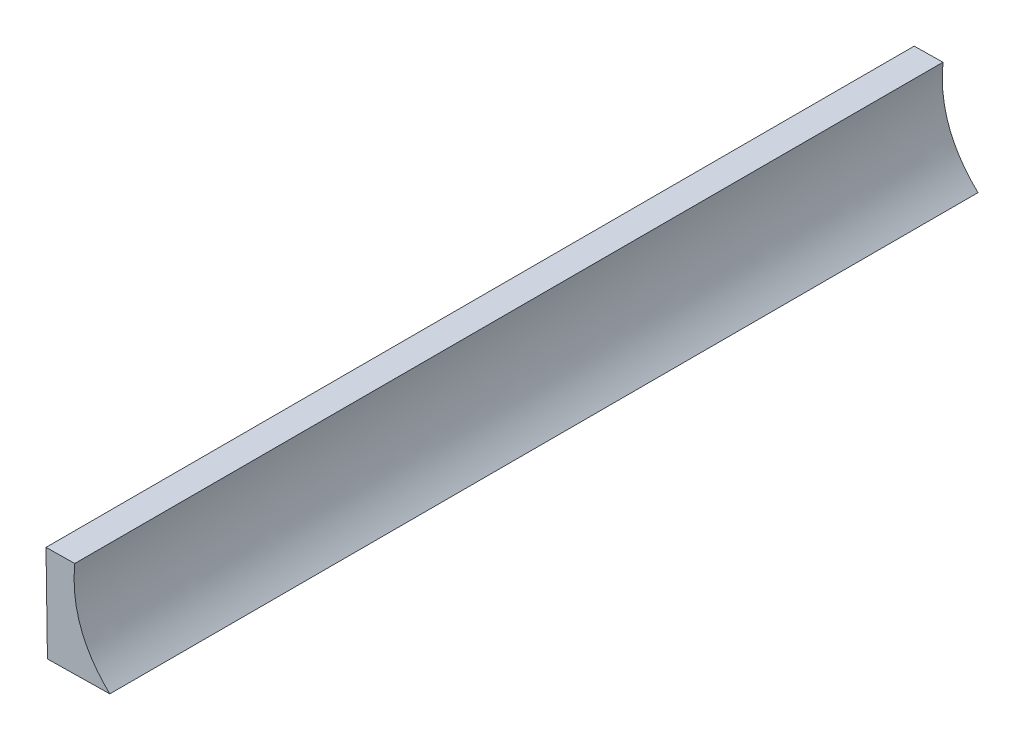
ISO-10303-21;
HEADER;
FILE_DESCRIPTION(('STEP AP214'),'2;1');
FILE_NAME('part.step','',(''),(''),'','','');
FILE_SCHEMA(('AUTOMOTIVE_DESIGN { 1 0 10303 214 1 1 1 1 }'));
ENDSEC;
DATA;
#1=APPLICATION_CONTEXT('core data for automotive mechanical design processes');
#2=APPLICATION_PROTOCOL_DEFINITION('international standard','automotive_design',2000,#1);
#3=PRODUCT_CONTEXT('',#1,'mechanical');
#4=PRODUCT('Part','Part','',(#3));
#5=PRODUCT_RELATED_PRODUCT_CATEGORY('part','',(#4));
#6=PRODUCT_DEFINITION_FORMATION('','',#4);
#7=PRODUCT_DEFINITION_CONTEXT('part definition',#1,'design');
#8=PRODUCT_DEFINITION('design','',#6,#7);
#9=PRODUCT_DEFINITION_SHAPE('','',#8);
#10=(LENGTH_UNIT() NAMED_UNIT(*) SI_UNIT(.MILLI.,.METRE.));
#11=(NAMED_UNIT(*) PLANE_ANGLE_UNIT() SI_UNIT($,.RADIAN.));
#12=(NAMED_UNIT(*) SI_UNIT($,.STERADIAN.) SOLID_ANGLE_UNIT());
#13=UNCERTAINTY_MEASURE_WITH_UNIT(LENGTH_MEASURE(1.E-05),#10,'distance_accuracy_value','');
#14=(GEOMETRIC_REPRESENTATION_CONTEXT(3) GLOBAL_UNCERTAINTY_ASSIGNED_CONTEXT((#13)) GLOBAL_UNIT_ASSIGNED_CONTEXT((#10,
#11,#12)) REPRESENTATION_CONTEXT('',''));
#15=CARTESIAN_POINT('',(0.,0.,0.));
#16=DIRECTION('',(0.,0.,1.));
#17=DIRECTION('',(1.,0.,0.));
#18=AXIS2_PLACEMENT_3D('',#15,#16,#17);
#19=CARTESIAN_POINT('',(-55.5127758023409,21.3702041703792,181.));
#20=DIRECTION('',(-0.015044122720481,0.99988683078215,0.));
#21=DIRECTION('',(-0.99988683078215,-0.015044122720481,0.));
#22=AXIS2_PLACEMENT_3D('',#19,#20,#21);
#23=PLANE('',#22);
#24=DIRECTION('',(0.99988683078215,0.015044122720481,0.));
#25=VECTOR('',#24,1.);
#26=CARTESIAN_POINT('',(-55.5127758023409,21.3702041703792,0.));
#27=LINE('',#26,#25);
#28=CARTESIAN_POINT('',(-55.5127758023409,21.3702041703792,0.));
#29=VERTEX_POINT('',#28);
#30=CARTESIAN_POINT('',(-49.5127758023409,21.4604791230478,0.));
#31=VERTEX_POINT('',#30);
#32=EDGE_CURVE('E121',#29,#31,#27,.T.);
#33=ORIENTED_EDGE('',*,*,#32,.F.);
#34=DIRECTION('',(0.,0.,-1.));
#35=VECTOR('',#34,1.);
#36=CARTESIAN_POINT('',(-55.5127758023409,21.3702041703792,181.));
#37=LINE('',#36,#35);
#38=CARTESIAN_POINT('',(-55.5127758023409,21.3702041703792,181.));
#39=VERTEX_POINT('',#38);
#40=EDGE_CURVE('E11',#39,#29,#37,.T.);
#41=ORIENTED_EDGE('',*,*,#40,.F.);
#42=DIRECTION('',(0.99988683078215,0.015044122720481,0.));
#43=VECTOR('',#42,1.);
#44=CARTESIAN_POINT('',(-55.5127758023409,21.3702041703792,181.));
#45=LINE('',#44,#43);
#46=CARTESIAN_POINT('',(-49.5127758023409,21.4604791230478,181.));
#47=VERTEX_POINT('',#46);
#48=EDGE_CURVE('E93',#39,#47,#45,.T.);
#49=ORIENTED_EDGE('',*,*,#48,.T.);
#50=DIRECTION('',(0.,0.,-1.));
#51=VECTOR('',#50,1.);
#52=CARTESIAN_POINT('',(-49.5127758023409,21.4604791230478,181.));
#53=LINE('',#52,#51);
#54=EDGE_CURVE('E36',#47,#31,#53,.T.);
#55=ORIENTED_EDGE('',*,*,#54,.T.);
#56=EDGE_LOOP('',(#33,#41,#49,#55));
#57=FACE_BOUND('',#56,.T.);
#58=ADVANCED_FACE('F33',(#57),#23,.T.);
#59=CARTESIAN_POINT('',(-55.5127758023409,21.3702041703792,181.));
#60=DIRECTION('',(0.99988683078215,0.015044122720481,0.));
#61=DIRECTION('',(-0.015044122720481,0.99988683078215,0.));
#62=AXIS2_PLACEMENT_3D('',#59,#60,#61);
#63=PLANE('',#62);
#64=DIRECTION('',(0.015044122720481,-0.99988683078215,0.));
#65=VECTOR('',#64,1.);
#66=CARTESIAN_POINT('',(-55.5127758023409,21.3702041703792,0.));
#67=LINE('',#66,#65);
#68=CARTESIAN_POINT('',(-55.2118592934453,1.37020417037915,0.));
#69=VERTEX_POINT('',#68);
#70=EDGE_CURVE('E66',#29,#69,#67,.T.);
#71=ORIENTED_EDGE('',*,*,#70,.T.);
#72=DIRECTION('',(0.,0.,-1.));
#73=VECTOR('',#72,1.);
#74=CARTESIAN_POINT('',(-55.2118592934453,1.37020417037915,181.));
#75=LINE('',#74,#73);
#76=CARTESIAN_POINT('',(-55.2118592934453,1.37020417037915,181.));
#77=VERTEX_POINT('',#76);
#78=EDGE_CURVE('E42',#77,#69,#75,.T.);
#79=ORIENTED_EDGE('',*,*,#78,.F.);
#80=DIRECTION('',(0.015044122720481,-0.99988683078215,0.));
#81=VECTOR('',#80,1.);
#82=CARTESIAN_POINT('',(-55.5127758023409,21.3702041703792,181.));
#83=LINE('',#82,#81);
#84=EDGE_CURVE('E83',#39,#77,#83,.T.);
#85=ORIENTED_EDGE('',*,*,#84,.F.);
#86=ORIENTED_EDGE('',*,*,#40,.T.);
#87=EDGE_LOOP('',(#71,#79,#85,#86));
#88=FACE_BOUND('',#87,.T.);
#89=ADVANCED_FACE('F107',(#88),#63,.F.);
#90=CARTESIAN_POINT('',(-55.2118592934453,1.37020417037915,181.));
#91=DIRECTION('',(-0.0150441227204812,0.99988683078215,0.));
#92=DIRECTION('',(-0.99988683078215,-0.0150441227204812,0.));
#93=AXIS2_PLACEMENT_3D('',#90,#91,#92);
#94=PLANE('',#93);
#95=DIRECTION('',(0.99988683078215,0.0150441227204812,0.));
#96=VECTOR('',#95,1.);
#97=CARTESIAN_POINT('',(-55.2118592934453,1.37020417037915,0.));
#98=LINE('',#97,#96);
#99=CARTESIAN_POINT('',(-42.2118592934453,1.56579990116127,0.));
#100=VERTEX_POINT('',#99);
#101=EDGE_CURVE('E90',#69,#100,#98,.T.);
#102=ORIENTED_EDGE('',*,*,#101,.T.);
#103=DIRECTION('',(0.,0.,-1.));
#104=VECTOR('',#103,1.);
#105=CARTESIAN_POINT('',(-42.2118592934453,1.56579990116127,181.));
#106=LINE('',#105,#104);
#107=CARTESIAN_POINT('',(-42.2118592934453,1.56579990116127,181.));
#108=VERTEX_POINT('',#107);
#109=EDGE_CURVE('E87',#108,#100,#106,.T.);
#110=ORIENTED_EDGE('',*,*,#109,.F.);
#111=DIRECTION('',(0.99988683078215,0.0150441227204812,0.));
#112=VECTOR('',#111,1.);
#113=CARTESIAN_POINT('',(-55.2118592934453,1.37020417037915,181.));
#114=LINE('',#113,#112);
#115=EDGE_CURVE('E78',#77,#108,#114,.T.);
#116=ORIENTED_EDGE('',*,*,#115,.F.);
#117=ORIENTED_EDGE('',*,*,#78,.T.);
#118=EDGE_LOOP('',(#102,#110,#116,#117));
#119=FACE_BOUND('',#118,.T.);
#120=ADVANCED_FACE('F88',(#119),#94,.F.);
#121=CARTESIAN_POINT('',(-49.5127758023409,21.4604791230478,181.));
#122=CARTESIAN_POINT('',(-50.7100902166149,9.62136358666321,181.));
#123=CARTESIAN_POINT('',(-42.2118592934453,1.56579990116127,181.));
#124=B_SPLINE_CURVE_WITH_KNOTS('',2,(#121,#122,#123),.UNSPECIFIED.,.F.,.F.,(3,3),(0.,1.),.UNSPECIFIED.);
#125=DIRECTION('',(0.,0.,-1.));
#126=VECTOR('',#125,1.);
#127=SURFACE_OF_LINEAR_EXTRUSION('',#124,#126);
#128=CARTESIAN_POINT('',(-49.5127758023409,21.4604791230478,0.));
#129=CARTESIAN_POINT('',(-50.7100902166149,9.62136358666321,0.));
#130=CARTESIAN_POINT('',(-42.2118592934453,1.56579990116127,0.));
#131=B_SPLINE_CURVE_WITH_KNOTS('',2,(#128,#129,#130),.UNSPECIFIED.,.F.,.F.,(3,3),(0.,1.),.UNSPECIFIED.);
#132=EDGE_CURVE('E122',#31,#100,#131,.T.);
#133=ORIENTED_EDGE('',*,*,#132,.F.);
#134=ORIENTED_EDGE('',*,*,#54,.F.);
#135=EDGE_CURVE('E82',#47,#108,#124,.T.);
#136=ORIENTED_EDGE('',*,*,#135,.T.);
#137=ORIENTED_EDGE('',*,*,#109,.T.);
#138=EDGE_LOOP('',(#133,#134,#136,#137));
#139=FACE_BOUND('',#138,.T.);
#140=ADVANCED_FACE('F92',(#139),#127,.T.);
#141=CARTESIAN_POINT('',(-48.286203882254,10.5672515493839,181.));
#142=DIRECTION('',(0.,0.,-1.));
#143=DIRECTION('',(-1.,0.,0.));
#144=AXIS2_PLACEMENT_3D('',#141,#142,#143);
#145=PLANE('',#144);
#146=ORIENTED_EDGE('',*,*,#48,.F.);
#147=ORIENTED_EDGE('',*,*,#84,.T.);
#148=ORIENTED_EDGE('',*,*,#115,.T.);
#149=ORIENTED_EDGE('',*,*,#135,.F.);
#150=EDGE_LOOP('',(#146,#147,#148,#149));
#151=FACE_BOUND('',#150,.T.);
#152=ADVANCED_FACE('F81',(#151),#145,.F.);
#153=CARTESIAN_POINT('',(-48.286203882254,10.5672515493839,0.));
#154=DIRECTION('',(0.,0.,-1.));
#155=DIRECTION('',(-1.,0.,0.));
#156=AXIS2_PLACEMENT_3D('',#153,#154,#155);
#157=PLANE('',#156);
#158=ORIENTED_EDGE('',*,*,#32,.T.);
#159=ORIENTED_EDGE('',*,*,#132,.T.);
#160=ORIENTED_EDGE('',*,*,#101,.F.);
#161=ORIENTED_EDGE('',*,*,#70,.F.);
#162=EDGE_LOOP('',(#158,#159,#160,#161));
#163=FACE_BOUND('',#162,.T.);
#164=ADVANCED_FACE('F110',(#163),#157,.T.);
#165=CLOSED_SHELL('',(#58,#89,#120,#140,#152,#164));
#166=MANIFOLD_SOLID_BREP('B2',#165);
#167=ADVANCED_BREP_SHAPE_REPRESENTATION('',(#18,#166),#14);
#168=SHAPE_DEFINITION_REPRESENTATION(#9,#167);
ENDSEC;
END-ISO-10303-21;
